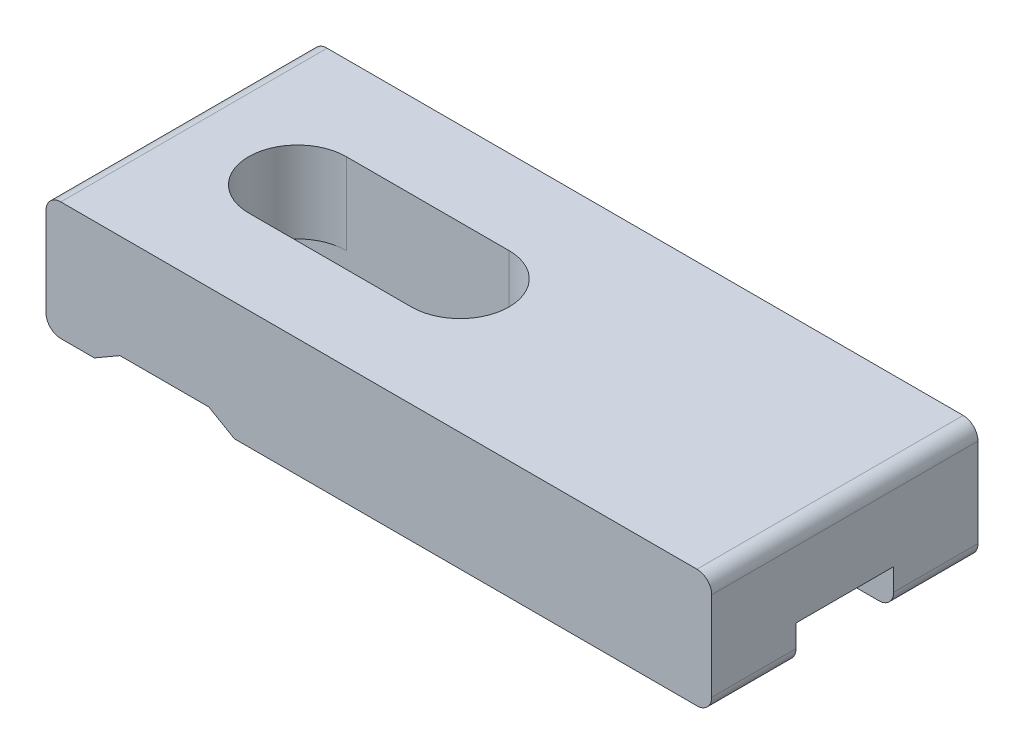
ISO-10303-21;
HEADER;
FILE_DESCRIPTION(('STEP AP214'),'2;1');
FILE_NAME('part.step','',(''),(''),'','','');
FILE_SCHEMA(('AUTOMOTIVE_DESIGN { 1 0 10303 214 1 1 1 1 }'));
ENDSEC;
DATA;
#1=APPLICATION_CONTEXT('core data for automotive mechanical design processes');
#2=APPLICATION_PROTOCOL_DEFINITION('international standard','automotive_design',2000,#1);
#3=PRODUCT_CONTEXT('',#1,'mechanical');
#4=PRODUCT('Part','Part','',(#3));
#5=PRODUCT_RELATED_PRODUCT_CATEGORY('part','',(#4));
#6=PRODUCT_DEFINITION_FORMATION('','',#4);
#7=PRODUCT_DEFINITION_CONTEXT('part definition',#1,'design');
#8=PRODUCT_DEFINITION('design','',#6,#7);
#9=PRODUCT_DEFINITION_SHAPE('','',#8);
#10=(LENGTH_UNIT() NAMED_UNIT(*) SI_UNIT(.MILLI.,.METRE.));
#11=(NAMED_UNIT(*) PLANE_ANGLE_UNIT() SI_UNIT($,.RADIAN.));
#12=(NAMED_UNIT(*) SI_UNIT($,.STERADIAN.) SOLID_ANGLE_UNIT());
#13=UNCERTAINTY_MEASURE_WITH_UNIT(LENGTH_MEASURE(1.E-05),#10,'distance_accuracy_value','');
#14=(GEOMETRIC_REPRESENTATION_CONTEXT(3) GLOBAL_UNCERTAINTY_ASSIGNED_CONTEXT((#13)) GLOBAL_UNIT_ASSIGNED_CONTEXT((#10,
#11,#12)) REPRESENTATION_CONTEXT('',''));
#15=CARTESIAN_POINT('',(0.,0.,0.));
#16=DIRECTION('',(0.,0.,1.));
#17=DIRECTION('',(1.,0.,0.));
#18=AXIS2_PLACEMENT_3D('',#15,#16,#17);
#19=CARTESIAN_POINT('',(-62.1670785358506,-7.19764912137909,24.));
#20=DIRECTION('',(0.,1.,0.));
#21=DIRECTION('',(0.,0.,1.));
#22=AXIS2_PLACEMENT_3D('',#19,#20,#21);
#23=PLANE('',#22);
#24=DIRECTION('',(-1.,0.,0.));
#25=VECTOR('',#24,1.);
#26=CARTESIAN_POINT('',(-40.8337452025173,-7.19764912137909,-8.8));
#27=LINE('',#26,#25);
#28=CARTESIAN_POINT('',(-53.4525473560343,-7.19764912137909,-8.8));
#29=VERTEX_POINT('',#28);
#30=CARTESIAN_POINT('',(-59.5004118691839,-7.19764912137909,-8.8));
#31=VERTEX_POINT('',#30);
#32=EDGE_CURVE('E299',#29,#31,#27,.T.);
#33=ORIENTED_EDGE('',*,*,#32,.T.);
#34=DIRECTION('',(0.,0.,-1.));
#35=VECTOR('',#34,1.);
#36=CARTESIAN_POINT('',(-59.5004118691839,-7.19764912137909,24.));
#37=LINE('',#36,#35);
#38=CARTESIAN_POINT('',(-59.5004118691839,-7.19764912137909,-24.));
#39=VERTEX_POINT('',#38);
#40=EDGE_CURVE('E42',#31,#39,#37,.T.);
#41=ORIENTED_EDGE('',*,*,#40,.T.);
#42=DIRECTION('',(1.,0.,0.));
#43=VECTOR('',#42,1.);
#44=CARTESIAN_POINT('',(-62.1670785358506,-7.19764912137909,-24.));
#45=LINE('',#44,#43);
#46=CARTESIAN_POINT('',(-53.4525473560343,-7.19764912137909,-24.));
#47=VERTEX_POINT('',#46);
#48=EDGE_CURVE('E210',#39,#47,#45,.T.);
#49=ORIENTED_EDGE('',*,*,#48,.T.);
#50=DIRECTION('',(0.,0.,1.));
#51=VECTOR('',#50,1.);
#52=CARTESIAN_POINT('',(-53.4525473560343,-7.19764912137909,-24.));
#53=LINE('',#52,#51);
#54=EDGE_CURVE('E213',#47,#29,#53,.T.);
#55=ORIENTED_EDGE('',*,*,#54,.T.);
#56=EDGE_LOOP('',(#33,#41,#49,#55));
#57=FACE_BOUND('',#56,.T.);
#58=ADVANCED_FACE('F34',(#57),#23,.F.);
#59=DIRECTION('',(1.,0.,0.));
#60=VECTOR('',#59,1.);
#61=CARTESIAN_POINT('',(-62.1670785358506,-7.19764912137909,24.));
#62=LINE('',#61,#60);
#63=CARTESIAN_POINT('',(-59.5004118691839,-7.19764912137909,24.));
#64=VERTEX_POINT('',#63);
#65=CARTESIAN_POINT('',(-53.4525473560343,-7.19764912137909,24.));
#66=VERTEX_POINT('',#65);
#67=EDGE_CURVE('E327',#64,#66,#62,.T.);
#68=ORIENTED_EDGE('',*,*,#67,.F.);
#69=DIRECTION('',(0.,0.,-1.));
#70=VECTOR('',#69,1.);
#71=CARTESIAN_POINT('',(-59.5004118691839,-7.19764912137909,24.));
#72=LINE('',#71,#70);
#73=CARTESIAN_POINT('',(-59.5004118691839,-7.19764912137909,8.80000000000001));
#74=VERTEX_POINT('',#73);
#75=EDGE_CURVE('E11',#64,#74,#72,.T.);
#76=ORIENTED_EDGE('',*,*,#75,.T.);
#77=DIRECTION('',(1.,0.,0.));
#78=VECTOR('',#77,1.);
#79=CARTESIAN_POINT('',(-11.5004118691839,-7.19764912137909,8.8));
#80=LINE('',#79,#78);
#81=CARTESIAN_POINT('',(-53.4525473560343,-7.19764912137909,8.80000000000001));
#82=VERTEX_POINT('',#81);
#83=EDGE_CURVE('E297',#74,#82,#80,.T.);
#84=ORIENTED_EDGE('',*,*,#83,.T.);
#85=EDGE_CURVE('E230',#82,#66,#53,.T.);
#86=ORIENTED_EDGE('',*,*,#85,.T.);
#87=EDGE_LOOP('',(#68,#76,#84,#86));
#88=FACE_BOUND('',#87,.T.);
#89=ADVANCED_FACE('F420',(#88),#23,.F.);
#90=CARTESIAN_POINT('',(-28.2149430490002,-7.19764912137909,-24.));
#91=VERTEX_POINT('',#90);
#92=CARTESIAN_POINT('',(55.1662547974827,-7.19764912137909,-24.));
#93=VERTEX_POINT('',#92);
#94=EDGE_CURVE('E219',#91,#93,#45,.T.);
#95=ORIENTED_EDGE('',*,*,#94,.T.);
#96=DIRECTION('',(0.,0.,-1.));
#97=VECTOR('',#96,1.);
#98=CARTESIAN_POINT('',(55.1662547974827,-7.19764912137909,24.));
#99=LINE('',#98,#97);
#100=CARTESIAN_POINT('',(55.1662547974827,-7.19764912137909,-8.8));
#101=VERTEX_POINT('',#100);
#102=EDGE_CURVE('E366',#93,#101,#99,.F.);
#103=ORIENTED_EDGE('',*,*,#102,.T.);
#104=CARTESIAN_POINT('',(-28.2149430490002,-7.19764912137909,-8.8));
#105=VERTEX_POINT('',#104);
#106=EDGE_CURVE('E301',#101,#105,#27,.T.);
#107=ORIENTED_EDGE('',*,*,#106,.T.);
#108=DIRECTION('',(0.,0.,1.));
#109=VECTOR('',#108,1.);
#110=CARTESIAN_POINT('',(-28.2149430490002,-7.19764912137909,-24.));
#111=LINE('',#110,#109);
#112=EDGE_CURVE('E259',#91,#105,#111,.T.);
#113=ORIENTED_EDGE('',*,*,#112,.F.);
#114=EDGE_LOOP('',(#95,#103,#107,#113));
#115=FACE_BOUND('',#114,.T.);
#116=ADVANCED_FACE('F456',(#115),#23,.F.);
#117=CARTESIAN_POINT('',(-62.1670785358506,14.1356842119542,24.));
#118=DIRECTION('',(1.,0.,0.));
#119=DIRECTION('',(0.,0.,-1.));
#120=AXIS2_PLACEMENT_3D('',#117,#118,#119);
#121=PLANE('',#120);
#122=DIRECTION('',(0.,-1.,0.));
#123=VECTOR('',#122,1.);
#124=CARTESIAN_POINT('',(-62.1670785358506,14.1356842119542,24.));
#125=LINE('',#124,#123);
#126=CARTESIAN_POINT('',(-62.1670785358506,11.4690175452876,24.));
#127=VERTEX_POINT('',#126);
#128=CARTESIAN_POINT('',(-62.1670785358506,-4.53098245471243,24.));
#129=VERTEX_POINT('',#128);
#130=EDGE_CURVE('E323',#127,#129,#125,.T.);
#131=ORIENTED_EDGE('',*,*,#130,.F.);
#132=DIRECTION('',(0.,0.,-1.));
#133=VECTOR('',#132,1.);
#134=CARTESIAN_POINT('',(-62.1670785358506,11.4690175452876,24.));
#135=LINE('',#134,#133);
#136=CARTESIAN_POINT('',(-62.1670785358506,11.4690175452876,-24.));
#137=VERTEX_POINT('',#136);
#138=EDGE_CURVE('E393',#127,#137,#135,.T.);
#139=ORIENTED_EDGE('',*,*,#138,.T.);
#140=DIRECTION('',(0.,-1.,0.));
#141=VECTOR('',#140,1.);
#142=CARTESIAN_POINT('',(-62.1670785358506,14.1356842119542,-24.));
#143=LINE('',#142,#141);
#144=CARTESIAN_POINT('',(-62.1670785358506,-4.53098245471243,-24.));
#145=VERTEX_POINT('',#144);
#146=EDGE_CURVE('E317',#137,#145,#143,.T.);
#147=ORIENTED_EDGE('',*,*,#146,.T.);
#148=DIRECTION('',(0.,0.,-1.));
#149=VECTOR('',#148,1.);
#150=CARTESIAN_POINT('',(-62.1670785358506,-4.53098245471243,24.));
#151=LINE('',#150,#149);
#152=CARTESIAN_POINT('',(-62.1670785358506,-4.53098245471243,-8.8));
#153=VERTEX_POINT('',#152);
#154=EDGE_CURVE('E391',#145,#153,#151,.F.);
#155=ORIENTED_EDGE('',*,*,#154,.T.);
#156=DIRECTION('',(0.,1.,0.));
#157=VECTOR('',#156,1.);
#158=CARTESIAN_POINT('',(-62.1670785358506,-7.19764912137909,-8.8));
#159=LINE('',#158,#157);
#160=CARTESIAN_POINT('',(-62.1670785358506,-0.530982454712426,-8.8));
#161=VERTEX_POINT('',#160);
#162=EDGE_CURVE('E269',#153,#161,#159,.T.);
#163=ORIENTED_EDGE('',*,*,#162,.T.);
#164=DIRECTION('',(0.,0.,1.));
#165=VECTOR('',#164,1.);
#166=CARTESIAN_POINT('',(-62.1670785358506,-0.530982454712426,-8.8));
#167=LINE('',#166,#165);
#168=CARTESIAN_POINT('',(-62.1670785358506,-0.530982454712428,8.8));
#169=VERTEX_POINT('',#168);
#170=EDGE_CURVE('E271',#161,#169,#167,.T.);
#171=ORIENTED_EDGE('',*,*,#170,.T.);
#172=DIRECTION('',(0.,-1.,0.));
#173=VECTOR('',#172,1.);
#174=CARTESIAN_POINT('',(-62.1670785358506,-7.1976491213791,8.8));
#175=LINE('',#174,#173);
#176=CARTESIAN_POINT('',(-62.1670785358506,-4.53098245471243,8.8));
#177=VERTEX_POINT('',#176);
#178=EDGE_CURVE('E275',#169,#177,#175,.T.);
#179=ORIENTED_EDGE('',*,*,#178,.T.);
#180=DIRECTION('',(0.,0.,-1.));
#181=VECTOR('',#180,1.);
#182=CARTESIAN_POINT('',(-62.1670785358506,-4.53098245471243,24.));
#183=LINE('',#182,#181);
#184=EDGE_CURVE('E57',#177,#129,#183,.F.);
#185=ORIENTED_EDGE('',*,*,#184,.T.);
#186=EDGE_LOOP('',(#131,#139,#147,#155,#163,#171,#179,#185));
#187=FACE_BOUND('',#186,.T.);
#188=ADVANCED_FACE('F397',(#187),#121,.F.);
#189=CARTESIAN_POINT('',(-28.2149430490002,-7.19764912137909,8.80000000000001));
#190=VERTEX_POINT('',#189);
#191=CARTESIAN_POINT('',(55.1662547974827,-7.19764912137909,8.79999999999999));
#192=VERTEX_POINT('',#191);
#193=EDGE_CURVE('E300',#190,#192,#80,.T.);
#194=ORIENTED_EDGE('',*,*,#193,.T.);
#195=DIRECTION('',(0.,0.,-1.));
#196=VECTOR('',#195,1.);
#197=CARTESIAN_POINT('',(55.1662547974827,-7.19764912137909,24.));
#198=LINE('',#197,#196);
#199=CARTESIAN_POINT('',(55.1662547974827,-7.19764912137909,24.));
#200=VERTEX_POINT('',#199);
#201=EDGE_CURVE('E376',#192,#200,#198,.F.);
#202=ORIENTED_EDGE('',*,*,#201,.T.);
#203=CARTESIAN_POINT('',(-28.2149430490002,-7.19764912137909,24.));
#204=VERTEX_POINT('',#203);
#205=EDGE_CURVE('E325',#204,#200,#62,.T.);
#206=ORIENTED_EDGE('',*,*,#205,.F.);
#207=EDGE_CURVE('E229',#190,#204,#111,.T.);
#208=ORIENTED_EDGE('',*,*,#207,.F.);
#209=EDGE_LOOP('',(#194,#202,#206,#208));
#210=FACE_BOUND('',#209,.T.);
#211=ADVANCED_FACE('F452',(#210),#23,.F.);
#212=CARTESIAN_POINT('',(57.8329214641494,-7.19764912137909,24.));
#213=DIRECTION('',(-1.,0.,0.));
#214=DIRECTION('',(0.,0.,1.));
#215=AXIS2_PLACEMENT_3D('',#212,#213,#214);
#216=PLANE('',#215);
#217=DIRECTION('',(0.,1.,0.));
#218=VECTOR('',#217,1.);
#219=CARTESIAN_POINT('',(57.8329214641494,-7.19764912137909,-8.8));
#220=LINE('',#219,#218);
#221=CARTESIAN_POINT('',(57.8329214641494,-4.53098245471243,-8.8));
#222=VERTEX_POINT('',#221);
#223=CARTESIAN_POINT('',(57.8329214641494,-0.530982454712426,-8.8));
#224=VERTEX_POINT('',#223);
#225=EDGE_CURVE('E268',#222,#224,#220,.T.);
#226=ORIENTED_EDGE('',*,*,#225,.F.);
#227=DIRECTION('',(0.,0.,-1.));
#228=VECTOR('',#227,1.);
#229=CARTESIAN_POINT('',(57.8329214641494,-4.53098245471243,24.));
#230=LINE('',#229,#228);
#231=CARTESIAN_POINT('',(57.8329214641494,-4.53098245471243,-24.));
#232=VERTEX_POINT('',#231);
#233=EDGE_CURVE('E355',#222,#232,#230,.T.);
#234=ORIENTED_EDGE('',*,*,#233,.T.);
#235=DIRECTION('',(0.,1.,0.));
#236=VECTOR('',#235,1.);
#237=CARTESIAN_POINT('',(57.8329214641494,-7.19764912137909,-24.));
#238=LINE('',#237,#236);
#239=CARTESIAN_POINT('',(57.8329214641494,11.4690175452876,-24.));
#240=VERTEX_POINT('',#239);
#241=EDGE_CURVE('E218',#232,#240,#238,.T.);
#242=ORIENTED_EDGE('',*,*,#241,.T.);
#243=DIRECTION('',(0.,0.,-1.));
#244=VECTOR('',#243,1.);
#245=CARTESIAN_POINT('',(57.8329214641494,11.4690175452876,24.));
#246=LINE('',#245,#244);
#247=CARTESIAN_POINT('',(57.8329214641494,11.4690175452876,24.));
#248=VERTEX_POINT('',#247);
#249=EDGE_CURVE('E350',#240,#248,#246,.F.);
#250=ORIENTED_EDGE('',*,*,#249,.T.);
#251=DIRECTION('',(0.,1.,0.));
#252=VECTOR('',#251,1.);
#253=CARTESIAN_POINT('',(57.8329214641494,-7.19764912137909,24.));
#254=LINE('',#253,#252);
#255=CARTESIAN_POINT('',(57.8329214641494,-4.53098245471243,24.));
#256=VERTEX_POINT('',#255);
#257=EDGE_CURVE('E329',#256,#248,#254,.T.);
#258=ORIENTED_EDGE('',*,*,#257,.F.);
#259=DIRECTION('',(0.,0.,-1.));
#260=VECTOR('',#259,1.);
#261=CARTESIAN_POINT('',(57.8329214641494,-4.53098245471243,24.));
#262=LINE('',#261,#260);
#263=CARTESIAN_POINT('',(57.8329214641494,-4.53098245471243,8.8));
#264=VERTEX_POINT('',#263);
#265=EDGE_CURVE('E352',#256,#264,#262,.T.);
#266=ORIENTED_EDGE('',*,*,#265,.T.);
#267=DIRECTION('',(0.,-1.,0.));
#268=VECTOR('',#267,1.);
#269=CARTESIAN_POINT('',(57.8329214641494,-7.1976491213791,8.8));
#270=LINE('',#269,#268);
#271=CARTESIAN_POINT('',(57.8329214641494,-0.530982454712428,8.8));
#272=VERTEX_POINT('',#271);
#273=EDGE_CURVE('E272',#272,#264,#270,.T.);
#274=ORIENTED_EDGE('',*,*,#273,.F.);
#275=DIRECTION('',(0.,0.,1.));
#276=VECTOR('',#275,1.);
#277=CARTESIAN_POINT('',(57.8329214641494,-0.530982454712426,-8.8));
#278=LINE('',#277,#276);
#279=EDGE_CURVE('E279',#224,#272,#278,.T.);
#280=ORIENTED_EDGE('',*,*,#279,.F.);
#281=EDGE_LOOP('',(#226,#234,#242,#250,#258,#266,#274,#280));
#282=FACE_BOUND('',#281,.T.);
#283=ADVANCED_FACE('F446',(#282),#216,.F.);
#284=CARTESIAN_POINT('',(57.8329214641494,14.1356842119542,24.));
#285=DIRECTION('',(0.,-1.,0.));
#286=DIRECTION('',(0.,0.,-1.));
#287=AXIS2_PLACEMENT_3D('',#284,#285,#286);
#288=PLANE('',#287);
#289=DIRECTION('',(1.,0.,0.));
#290=VECTOR('',#289,1.);
#291=CARTESIAN_POINT('',(-11.5004118691839,14.1356842119542,8.8));
#292=LINE('',#291,#290);
#293=CARTESIAN_POINT('',(-40.8337452025173,14.1356842119542,8.8));
#294=VERTEX_POINT('',#293);
#295=CARTESIAN_POINT('',(-11.5004118691839,14.1356842119542,8.8));
#296=VERTEX_POINT('',#295);
#297=EDGE_CURVE('E306',#294,#296,#292,.T.);
#298=ORIENTED_EDGE('',*,*,#297,.F.);
#299=CARTESIAN_POINT('',(-40.8337452025173,14.1356842119542,0.));
#300=DIRECTION('',(0.,1.,0.));
#301=DIRECTION('',(0.,0.,-1.));
#302=AXIS2_PLACEMENT_3D('',#299,#300,#301);
#303=CIRCLE('',#302,8.8);
#304=CARTESIAN_POINT('',(-40.8337452025173,14.1356842119542,-8.8));
#305=VERTEX_POINT('',#304);
#306=EDGE_CURVE('E296',#305,#294,#303,.T.);
#307=ORIENTED_EDGE('',*,*,#306,.F.);
#308=DIRECTION('',(-1.,0.,0.));
#309=VECTOR('',#308,1.);
#310=CARTESIAN_POINT('',(-40.8337452025173,14.1356842119542,-8.8));
#311=LINE('',#310,#309);
#312=CARTESIAN_POINT('',(-11.5004118691839,14.1356842119542,-8.8));
#313=VERTEX_POINT('',#312);
#314=EDGE_CURVE('E312',#313,#305,#311,.T.);
#315=ORIENTED_EDGE('',*,*,#314,.F.);
#316=CARTESIAN_POINT('',(-11.5004118691839,14.1356842119542,0.));
#317=DIRECTION('',(0.,1.,0.));
#318=DIRECTION('',(0.,0.,-1.));
#319=AXIS2_PLACEMENT_3D('',#316,#317,#318);
#320=CIRCLE('',#319,8.8);
#321=EDGE_CURVE('E309',#296,#313,#320,.T.);
#322=ORIENTED_EDGE('',*,*,#321,.F.);
#323=EDGE_LOOP('',(#298,#307,#315,#322));
#324=FACE_BOUND('',#323,.T.);
#325=DIRECTION('',(-1.,0.,0.));
#326=VECTOR('',#325,1.);
#327=CARTESIAN_POINT('',(57.8329214641494,14.1356842119542,24.));
#328=LINE('',#327,#326);
#329=CARTESIAN_POINT('',(55.1662547974827,14.1356842119542,24.));
#330=VERTEX_POINT('',#329);
#331=CARTESIAN_POINT('',(-59.5004118691839,14.1356842119542,24.));
#332=VERTEX_POINT('',#331);
#333=EDGE_CURVE('E332',#330,#332,#328,.T.);
#334=ORIENTED_EDGE('',*,*,#333,.F.);
#335=DIRECTION('',(0.,0.,-1.));
#336=VECTOR('',#335,1.);
#337=CARTESIAN_POINT('',(55.1662547974827,14.1356842119542,24.));
#338=LINE('',#337,#336);
#339=CARTESIAN_POINT('',(55.1662547974827,14.1356842119542,-24.));
#340=VERTEX_POINT('',#339);
#341=EDGE_CURVE('E387',#330,#340,#338,.T.);
#342=ORIENTED_EDGE('',*,*,#341,.T.);
#343=DIRECTION('',(-1.,0.,0.));
#344=VECTOR('',#343,1.);
#345=CARTESIAN_POINT('',(57.8329214641494,14.1356842119542,-24.));
#346=LINE('',#345,#344);
#347=CARTESIAN_POINT('',(-59.5004118691839,14.1356842119542,-24.));
#348=VERTEX_POINT('',#347);
#349=EDGE_CURVE('E326',#340,#348,#346,.T.);
#350=ORIENTED_EDGE('',*,*,#349,.T.);
#351=DIRECTION('',(0.,0.,-1.));
#352=VECTOR('',#351,1.);
#353=CARTESIAN_POINT('',(-59.5004118691839,14.1356842119542,24.));
#354=LINE('',#353,#352);
#355=EDGE_CURVE('E385',#348,#332,#354,.F.);
#356=ORIENTED_EDGE('',*,*,#355,.T.);
#357=EDGE_LOOP('',(#334,#342,#350,#356));
#358=FACE_BOUND('',#357,.T.);
#359=ADVANCED_FACE('F438',(#324,#358),#288,.F.);
#360=CARTESIAN_POINT('',(-62.1670785358506,-7.19764912137909,24.));
#361=DIRECTION('',(0.,0.,1.));
#362=DIRECTION('',(1.,0.,0.));
#363=AXIS2_PLACEMENT_3D('',#360,#361,#362);
#364=PLANE('',#363);
#365=ORIENTED_EDGE('',*,*,#205,.T.);
#366=CARTESIAN_POINT('',(55.1662547974827,-4.53098245471243,24.));
#367=DIRECTION('',(0.,0.,1.));
#368=DIRECTION('',(1.,0.,0.));
#369=AXIS2_PLACEMENT_3D('',#366,#367,#368);
#370=CIRCLE('',#369,2.66666666666667);
#371=EDGE_CURVE('E383',#200,#256,#370,.T.);
#372=ORIENTED_EDGE('',*,*,#371,.T.);
#373=ORIENTED_EDGE('',*,*,#257,.T.);
#374=CARTESIAN_POINT('',(55.1662547974827,11.4690175452876,24.));
#375=DIRECTION('',(0.,0.,1.));
#376=DIRECTION('',(1.,0.,0.));
#377=AXIS2_PLACEMENT_3D('',#374,#375,#376);
#378=CIRCLE('',#377,2.66666666666667);
#379=EDGE_CURVE('E381',#248,#330,#378,.T.);
#380=ORIENTED_EDGE('',*,*,#379,.T.);
#381=ORIENTED_EDGE('',*,*,#333,.T.);
#382=CARTESIAN_POINT('',(-59.5004118691839,11.4690175452876,24.));
#383=DIRECTION('',(0.,0.,1.));
#384=DIRECTION('',(1.,0.,0.));
#385=AXIS2_PLACEMENT_3D('',#382,#383,#384);
#386=CIRCLE('',#385,2.66666666666667);
#387=EDGE_CURVE('E379',#332,#127,#386,.T.);
#388=ORIENTED_EDGE('',*,*,#387,.T.);
#389=ORIENTED_EDGE('',*,*,#130,.T.);
#390=CARTESIAN_POINT('',(-59.5004118691839,-4.53098245471243,24.));
#391=DIRECTION('',(0.,0.,1.));
#392=DIRECTION('',(1.,0.,0.));
#393=AXIS2_PLACEMENT_3D('',#390,#391,#392);
#394=CIRCLE('',#393,2.66666666666667);
#395=EDGE_CURVE('E49',#129,#64,#394,.T.);
#396=ORIENTED_EDGE('',*,*,#395,.T.);
#397=ORIENTED_EDGE('',*,*,#67,.T.);
#398=DIRECTION('',(-0.866025403784442,-0.499999999999995,0.));
#399=VECTOR('',#398,1.);
#400=CARTESIAN_POINT('',(-53.4525473560343,-7.19764912137909,24.));
#401=LINE('',#400,#399);
#402=CARTESIAN_POINT('',(-48.8337452025173,-4.53098245471243,24.));
#403=VERTEX_POINT('',#402);
#404=EDGE_CURVE('E246',#403,#66,#401,.T.);
#405=ORIENTED_EDGE('',*,*,#404,.F.);
#406=DIRECTION('',(-1.,0.,0.));
#407=VECTOR('',#406,1.);
#408=CARTESIAN_POINT('',(-48.8337452025173,-4.53098245471243,24.));
#409=LINE('',#408,#407);
#410=CARTESIAN_POINT('',(-32.8337452025173,-4.53098245471243,24.));
#411=VERTEX_POINT('',#410);
#412=EDGE_CURVE('E238',#411,#403,#409,.T.);
#413=ORIENTED_EDGE('',*,*,#412,.F.);
#414=DIRECTION('',(-0.866025403784442,0.499999999999994,0.));
#415=VECTOR('',#414,1.);
#416=CARTESIAN_POINT('',(-32.8337452025173,-4.53098245471243,24.));
#417=LINE('',#416,#415);
#418=EDGE_CURVE('E242',#204,#411,#417,.T.);
#419=ORIENTED_EDGE('',*,*,#418,.F.);
#420=EDGE_LOOP('',(#365,#372,#373,#380,#381,#388,#389,#396,#397,#405,#413,#419));
#421=FACE_BOUND('',#420,.T.);
#422=ADVANCED_FACE('F434',(#421),#364,.T.);
#423=CARTESIAN_POINT('',(-62.1670785358506,-7.19764912137909,-24.));
#424=DIRECTION('',(0.,0.,1.));
#425=DIRECTION('',(1.,0.,0.));
#426=AXIS2_PLACEMENT_3D('',#423,#424,#425);
#427=PLANE('',#426);
#428=ORIENTED_EDGE('',*,*,#241,.F.);
#429=CARTESIAN_POINT('',(55.1662547974827,-4.53098245471243,-24.));
#430=DIRECTION('',(0.,0.,1.));
#431=DIRECTION('',(1.,0.,0.));
#432=AXIS2_PLACEMENT_3D('',#429,#430,#431);
#433=CIRCLE('',#432,2.66666666666667);
#434=EDGE_CURVE('E364',#232,#93,#433,.F.);
#435=ORIENTED_EDGE('',*,*,#434,.T.);
#436=ORIENTED_EDGE('',*,*,#94,.F.);
#437=DIRECTION('',(-0.866025403784442,0.499999999999994,0.));
#438=VECTOR('',#437,1.);
#439=CARTESIAN_POINT('',(-32.8337452025173,-4.53098245471243,-24.));
#440=LINE('',#439,#438);
#441=CARTESIAN_POINT('',(-32.8337452025173,-4.53098245471243,-24.));
#442=VERTEX_POINT('',#441);
#443=EDGE_CURVE('E237',#91,#442,#440,.T.);
#444=ORIENTED_EDGE('',*,*,#443,.T.);
#445=DIRECTION('',(-1.,0.,0.));
#446=VECTOR('',#445,1.);
#447=CARTESIAN_POINT('',(-48.8337452025173,-4.53098245471243,-24.));
#448=LINE('',#447,#446);
#449=CARTESIAN_POINT('',(-48.8337452025173,-4.53098245471243,-24.));
#450=VERTEX_POINT('',#449);
#451=EDGE_CURVE('E236',#442,#450,#448,.T.);
#452=ORIENTED_EDGE('',*,*,#451,.T.);
#453=DIRECTION('',(-0.866025403784442,-0.499999999999995,0.));
#454=VECTOR('',#453,1.);
#455=CARTESIAN_POINT('',(-53.4525473560343,-7.19764912137909,-24.));
#456=LINE('',#455,#454);
#457=EDGE_CURVE('E225',#450,#47,#456,.T.);
#458=ORIENTED_EDGE('',*,*,#457,.T.);
#459=ORIENTED_EDGE('',*,*,#48,.F.);
#460=CARTESIAN_POINT('',(-59.5004118691839,-4.53098245471243,-24.));
#461=DIRECTION('',(0.,0.,1.));
#462=DIRECTION('',(1.,0.,0.));
#463=AXIS2_PLACEMENT_3D('',#460,#461,#462);
#464=CIRCLE('',#463,2.66666666666667);
#465=EDGE_CURVE('E358',#39,#145,#464,.F.);
#466=ORIENTED_EDGE('',*,*,#465,.T.);
#467=ORIENTED_EDGE('',*,*,#146,.F.);
#468=CARTESIAN_POINT('',(-59.5004118691839,11.4690175452876,-24.));
#469=DIRECTION('',(0.,0.,1.));
#470=DIRECTION('',(1.,0.,0.));
#471=AXIS2_PLACEMENT_3D('',#468,#469,#470);
#472=CIRCLE('',#471,2.66666666666667);
#473=EDGE_CURVE('E360',#137,#348,#472,.F.);
#474=ORIENTED_EDGE('',*,*,#473,.T.);
#475=ORIENTED_EDGE('',*,*,#349,.F.);
#476=CARTESIAN_POINT('',(55.1662547974827,11.4690175452876,-24.));
#477=DIRECTION('',(0.,0.,1.));
#478=DIRECTION('',(1.,0.,0.));
#479=AXIS2_PLACEMENT_3D('',#476,#477,#478);
#480=CIRCLE('',#479,2.66666666666667);
#481=EDGE_CURVE('E362',#340,#240,#480,.F.);
#482=ORIENTED_EDGE('',*,*,#481,.T.);
#483=EDGE_LOOP('',(#428,#435,#436,#444,#452,#458,#459,#466,#467,#474,#475,#482));
#484=FACE_BOUND('',#483,.T.);
#485=ADVANCED_FACE('F233',(#484),#427,.F.);
#486=CARTESIAN_POINT('',(-40.8337452025173,-7.19764912137909,0.));
#487=DIRECTION('',(0.,1.,0.));
#488=DIRECTION('',(0.,0.,1.));
#489=AXIS2_PLACEMENT_3D('',#486,#487,#488);
#490=CYLINDRICAL_SURFACE('',#489,8.8);
#491=DIRECTION('',(0.,1.,0.));
#492=VECTOR('',#491,1.);
#493=CARTESIAN_POINT('',(-40.8337452025173,-7.19764912137909,8.80000000000001));
#494=LINE('',#493,#492);
#495=CARTESIAN_POINT('',(-40.8337452025173,-0.530982454712428,8.8));
#496=VERTEX_POINT('',#495);
#497=EDGE_CURVE('E303',#496,#294,#494,.T.);
#498=ORIENTED_EDGE('',*,*,#497,.F.);
#499=CARTESIAN_POINT('',(-40.8337452025173,-0.530982454712427,0.));
#500=DIRECTION('',(0.,1.,0.));
#501=DIRECTION('',(0.,0.,1.));
#502=AXIS2_PLACEMENT_3D('',#499,#500,#501);
#503=CIRCLE('',#502,8.8);
#504=CARTESIAN_POINT('',(-40.8337452025173,-0.530982454712426,-8.8));
#505=VERTEX_POINT('',#504);
#506=EDGE_CURVE('E293',#496,#505,#503,.F.);
#507=ORIENTED_EDGE('',*,*,#506,.T.);
#508=DIRECTION('',(0.,1.,0.));
#509=VECTOR('',#508,1.);
#510=CARTESIAN_POINT('',(-40.8337452025173,-7.19764912137909,-8.8));
#511=LINE('',#510,#509);
#512=EDGE_CURVE('E315',#505,#305,#511,.T.);
#513=ORIENTED_EDGE('',*,*,#512,.T.);
#514=ORIENTED_EDGE('',*,*,#306,.T.);
#515=EDGE_LOOP('',(#498,#507,#513,#514));
#516=FACE_BOUND('',#515,.T.);
#517=ADVANCED_FACE('F444',(#516),#490,.F.);
#518=CARTESIAN_POINT('',(-40.8337452025173,-7.19764912137909,-8.8));
#519=DIRECTION('',(0.,0.,-1.));
#520=DIRECTION('',(-1.,0.,0.));
#521=AXIS2_PLACEMENT_3D('',#518,#519,#520);
#522=PLANE('',#521);
#523=ORIENTED_EDGE('',*,*,#106,.F.);
#524=CARTESIAN_POINT('',(55.1662547974827,-4.53098245471243,-8.8));
#525=DIRECTION('',(0.,0.,-1.));
#526=DIRECTION('',(-1.,0.,0.));
#527=AXIS2_PLACEMENT_3D('',#524,#525,#526);
#528=CIRCLE('',#527,2.66666666666667);
#529=EDGE_CURVE('E370',#101,#222,#528,.F.);
#530=ORIENTED_EDGE('',*,*,#529,.T.);
#531=ORIENTED_EDGE('',*,*,#225,.T.);
#532=DIRECTION('',(1.,0.,0.));
#533=VECTOR('',#532,1.);
#534=CARTESIAN_POINT('',(-62.1670785358506,-0.530982454712426,-8.8));
#535=LINE('',#534,#533);
#536=CARTESIAN_POINT('',(-11.5004118691839,-0.530982454712426,-8.8));
#537=VERTEX_POINT('',#536);
#538=EDGE_CURVE('E277',#537,#224,#535,.T.);
#539=ORIENTED_EDGE('',*,*,#538,.F.);
#540=DIRECTION('',(0.,1.,0.));
#541=VECTOR('',#540,1.);
#542=CARTESIAN_POINT('',(-11.5004118691839,-7.19764912137909,-8.8));
#543=LINE('',#542,#541);
#544=EDGE_CURVE('E318',#537,#313,#543,.T.);
#545=ORIENTED_EDGE('',*,*,#544,.T.);
#546=ORIENTED_EDGE('',*,*,#314,.T.);
#547=ORIENTED_EDGE('',*,*,#512,.F.);
#548=EDGE_CURVE('E289',#161,#505,#535,.T.);
#549=ORIENTED_EDGE('',*,*,#548,.F.);
#550=ORIENTED_EDGE('',*,*,#162,.F.);
#551=CARTESIAN_POINT('',(-59.5004118691839,-4.53098245471243,-8.8));
#552=DIRECTION('',(0.,0.,-1.));
#553=DIRECTION('',(-1.,0.,0.));
#554=AXIS2_PLACEMENT_3D('',#551,#552,#553);
#555=CIRCLE('',#554,2.66666666666667);
#556=EDGE_CURVE('E368',#153,#31,#555,.F.);
#557=ORIENTED_EDGE('',*,*,#556,.T.);
#558=ORIENTED_EDGE('',*,*,#32,.F.);
#559=DIRECTION('',(0.866025403784442,0.499999999999995,0.));
#560=VECTOR('',#559,1.);
#561=CARTESIAN_POINT('',(-43.9884457408965,-1.73354750624135,-8.8));
#562=LINE('',#561,#560);
#563=CARTESIAN_POINT('',(-48.8337452025173,-4.53098245471243,-8.8));
#564=VERTEX_POINT('',#563);
#565=EDGE_CURVE('E228',#29,#564,#562,.T.);
#566=ORIENTED_EDGE('',*,*,#565,.T.);
#567=DIRECTION('',(1.,0.,0.));
#568=VECTOR('',#567,1.);
#569=CARTESIAN_POINT('',(-40.8337452025173,-4.53098245471243,-8.8));
#570=LINE('',#569,#568);
#571=CARTESIAN_POINT('',(-32.8337452025173,-4.53098245471243,-8.8));
#572=VERTEX_POINT('',#571);
#573=EDGE_CURVE('E264',#564,#572,#570,.T.);
#574=ORIENTED_EDGE('',*,*,#573,.T.);
#575=DIRECTION('',(0.866025403784442,-0.499999999999995,0.));
#576=VECTOR('',#575,1.);
#577=CARTESIAN_POINT('',(-37.6790446641381,-1.73354750624135,-8.8));
#578=LINE('',#577,#576);
#579=EDGE_CURVE('E253',#572,#105,#578,.T.);
#580=ORIENTED_EDGE('',*,*,#579,.T.);
#581=EDGE_LOOP('',(#523,#530,#531,#539,#545,#546,#547,#549,#550,#557,#558,#566,#574,#580));
#582=FACE_BOUND('',#581,.T.);
#583=ADVANCED_FACE('F409',(#582),#522,.F.);
#584=CARTESIAN_POINT('',(-11.5004118691839,-7.19764912137909,0.));
#585=DIRECTION('',(0.,1.,0.));
#586=DIRECTION('',(0.,0.,1.));
#587=AXIS2_PLACEMENT_3D('',#584,#585,#586);
#588=CYLINDRICAL_SURFACE('',#587,8.8);
#589=ORIENTED_EDGE('',*,*,#544,.F.);
#590=CARTESIAN_POINT('',(-11.5004118691839,-0.530982454712427,0.));
#591=DIRECTION('',(0.,1.,0.));
#592=DIRECTION('',(0.,0.,1.));
#593=AXIS2_PLACEMENT_3D('',#590,#591,#592);
#594=CIRCLE('',#593,8.8);
#595=CARTESIAN_POINT('',(-11.5004118691839,-0.530982454712428,8.8));
#596=VERTEX_POINT('',#595);
#597=EDGE_CURVE('E287',#537,#596,#594,.F.);
#598=ORIENTED_EDGE('',*,*,#597,.T.);
#599=DIRECTION('',(0.,1.,0.));
#600=VECTOR('',#599,1.);
#601=CARTESIAN_POINT('',(-11.5004118691839,-7.19764912137909,8.8));
#602=LINE('',#601,#600);
#603=EDGE_CURVE('E320',#596,#296,#602,.T.);
#604=ORIENTED_EDGE('',*,*,#603,.T.);
#605=ORIENTED_EDGE('',*,*,#321,.T.);
#606=EDGE_LOOP('',(#589,#598,#604,#605));
#607=FACE_BOUND('',#606,.T.);
#608=ADVANCED_FACE('F488',(#607),#588,.F.);
#609=CARTESIAN_POINT('',(-11.5004118691839,-7.19764912137909,8.8));
#610=DIRECTION('',(0.,0.,1.));
#611=DIRECTION('',(1.,0.,0.));
#612=AXIS2_PLACEMENT_3D('',#609,#610,#611);
#613=PLANE('',#612);
#614=ORIENTED_EDGE('',*,*,#273,.T.);
#615=CARTESIAN_POINT('',(55.1662547974827,-4.53098245471243,8.79999999999998));
#616=DIRECTION('',(0.,0.,1.));
#617=DIRECTION('',(1.,0.,0.));
#618=AXIS2_PLACEMENT_3D('',#615,#616,#617);
#619=CIRCLE('',#618,2.66666666666667);
#620=EDGE_CURVE('E374',#264,#192,#619,.F.);
#621=ORIENTED_EDGE('',*,*,#620,.T.);
#622=ORIENTED_EDGE('',*,*,#193,.F.);
#623=DIRECTION('',(-0.866025403784442,0.499999999999995,0.));
#624=VECTOR('',#623,1.);
#625=CARTESIAN_POINT('',(-15.6790446641379,-14.435253428413,8.8));
#626=LINE('',#625,#624);
#627=CARTESIAN_POINT('',(-32.8337452025173,-4.53098245471242,8.8));
#628=VERTEX_POINT('',#627);
#629=EDGE_CURVE('E335',#190,#628,#626,.T.);
#630=ORIENTED_EDGE('',*,*,#629,.T.);
#631=DIRECTION('',(-1.,0.,0.));
#632=VECTOR('',#631,1.);
#633=CARTESIAN_POINT('',(-11.5004118691839,-4.53098245471243,8.8));
#634=LINE('',#633,#632);
#635=CARTESIAN_POINT('',(-48.8337452025173,-4.53098245471243,8.80000000000001));
#636=VERTEX_POINT('',#635);
#637=EDGE_CURVE('E344',#628,#636,#634,.T.);
#638=ORIENTED_EDGE('',*,*,#637,.T.);
#639=DIRECTION('',(-0.866025403784442,-0.499999999999995,0.));
#640=VECTOR('',#639,1.);
#641=CARTESIAN_POINT('',(-21.9884457408963,10.9681584159303,8.8));
#642=LINE('',#641,#640);
#643=EDGE_CURVE('E347',#636,#82,#642,.T.);
#644=ORIENTED_EDGE('',*,*,#643,.T.);
#645=ORIENTED_EDGE('',*,*,#83,.F.);
#646=CARTESIAN_POINT('',(-59.5004118691839,-4.53098245471243,8.80000000000001));
#647=DIRECTION('',(0.,0.,1.));
#648=DIRECTION('',(1.,0.,0.));
#649=AXIS2_PLACEMENT_3D('',#646,#647,#648);
#650=CIRCLE('',#649,2.66666666666667);
#651=EDGE_CURVE('E372',#74,#177,#650,.F.);
#652=ORIENTED_EDGE('',*,*,#651,.T.);
#653=ORIENTED_EDGE('',*,*,#178,.F.);
#654=DIRECTION('',(1.,0.,0.));
#655=VECTOR('',#654,1.);
#656=CARTESIAN_POINT('',(-62.1670785358506,-0.530982454712428,8.8));
#657=LINE('',#656,#655);
#658=EDGE_CURVE('E284',#169,#496,#657,.T.);
#659=ORIENTED_EDGE('',*,*,#658,.T.);
#660=ORIENTED_EDGE('',*,*,#497,.T.);
#661=ORIENTED_EDGE('',*,*,#297,.T.);
#662=ORIENTED_EDGE('',*,*,#603,.F.);
#663=EDGE_CURVE('E288',#596,#272,#657,.T.);
#664=ORIENTED_EDGE('',*,*,#663,.T.);
#665=EDGE_LOOP('',(#614,#621,#622,#630,#638,#644,#645,#652,#653,#659,#660,#661,#662,#664));
#666=FACE_BOUND('',#665,.T.);
#667=ADVANCED_FACE('F423',(#666),#613,.F.);
#668=CARTESIAN_POINT('',(-62.1670785358506,-0.530982454712426,-8.8));
#669=DIRECTION('',(0.,1.,0.));
#670=DIRECTION('',(0.,0.,1.));
#671=AXIS2_PLACEMENT_3D('',#668,#669,#670);
#672=PLANE('',#671);
#673=ORIENTED_EDGE('',*,*,#538,.T.);
#674=ORIENTED_EDGE('',*,*,#279,.T.);
#675=ORIENTED_EDGE('',*,*,#663,.F.);
#676=ORIENTED_EDGE('',*,*,#597,.F.);
#677=EDGE_LOOP('',(#673,#674,#675,#676));
#678=FACE_BOUND('',#677,.T.);
#679=ADVANCED_FACE('F485',(#678),#672,.F.);
#680=ORIENTED_EDGE('',*,*,#658,.F.);
#681=ORIENTED_EDGE('',*,*,#170,.F.);
#682=ORIENTED_EDGE('',*,*,#548,.T.);
#683=ORIENTED_EDGE('',*,*,#506,.F.);
#684=EDGE_LOOP('',(#680,#681,#682,#683));
#685=FACE_BOUND('',#684,.T.);
#686=ADVANCED_FACE('F413',(#685),#672,.F.);
#687=CARTESIAN_POINT('',(-32.8337452025173,-4.53098245471243,-24.));
#688=DIRECTION('',(0.499999999999995,0.866025403784442,0.));
#689=DIRECTION('',(-0.866025403784442,0.499999999999995,0.));
#690=AXIS2_PLACEMENT_3D('',#687,#688,#689);
#691=PLANE('',#690);
#692=ORIENTED_EDGE('',*,*,#207,.T.);
#693=ORIENTED_EDGE('',*,*,#418,.T.);
#694=DIRECTION('',(0.,0.,1.));
#695=VECTOR('',#694,1.);
#696=CARTESIAN_POINT('',(-32.8337452025173,-4.53098245471243,-24.));
#697=LINE('',#696,#695);
#698=EDGE_CURVE('E258',#628,#411,#697,.T.);
#699=ORIENTED_EDGE('',*,*,#698,.F.);
#700=ORIENTED_EDGE('',*,*,#629,.F.);
#701=EDGE_LOOP('',(#692,#693,#699,#700));
#702=FACE_BOUND('',#701,.T.);
#703=ADVANCED_FACE('F530',(#702),#691,.F.);
#704=CARTESIAN_POINT('',(-48.8337452025173,-4.53098245471243,-24.));
#705=DIRECTION('',(0.,1.,0.));
#706=DIRECTION('',(0.,0.,1.));
#707=AXIS2_PLACEMENT_3D('',#704,#705,#706);
#708=PLANE('',#707);
#709=ORIENTED_EDGE('',*,*,#698,.T.);
#710=ORIENTED_EDGE('',*,*,#412,.T.);
#711=DIRECTION('',(0.,0.,1.));
#712=VECTOR('',#711,1.);
#713=CARTESIAN_POINT('',(-48.8337452025173,-4.53098245471243,-24.));
#714=LINE('',#713,#712);
#715=EDGE_CURVE('E254',#636,#403,#714,.T.);
#716=ORIENTED_EDGE('',*,*,#715,.F.);
#717=ORIENTED_EDGE('',*,*,#637,.F.);
#718=EDGE_LOOP('',(#709,#710,#716,#717));
#719=FACE_BOUND('',#718,.T.);
#720=ADVANCED_FACE('F429',(#719),#708,.F.);
#721=CARTESIAN_POINT('',(-53.4525473560343,-7.19764912137909,-24.));
#722=DIRECTION('',(-0.499999999999995,0.866025403784442,0.));
#723=DIRECTION('',(-0.866025403784442,-0.499999999999995,0.));
#724=AXIS2_PLACEMENT_3D('',#721,#722,#723);
#725=PLANE('',#724);
#726=ORIENTED_EDGE('',*,*,#715,.T.);
#727=ORIENTED_EDGE('',*,*,#404,.T.);
#728=ORIENTED_EDGE('',*,*,#85,.F.);
#729=ORIENTED_EDGE('',*,*,#643,.F.);
#730=EDGE_LOOP('',(#726,#727,#728,#729));
#731=FACE_BOUND('',#730,.T.);
#732=ADVANCED_FACE('F427',(#731),#725,.F.);
#733=ORIENTED_EDGE('',*,*,#54,.F.);
#734=ORIENTED_EDGE('',*,*,#457,.F.);
#735=EDGE_CURVE('E251',#450,#564,#714,.T.);
#736=ORIENTED_EDGE('',*,*,#735,.T.);
#737=ORIENTED_EDGE('',*,*,#565,.F.);
#738=EDGE_LOOP('',(#733,#734,#736,#737));
#739=FACE_BOUND('',#738,.T.);
#740=ADVANCED_FACE('F223',(#739),#725,.F.);
#741=ORIENTED_EDGE('',*,*,#735,.F.);
#742=ORIENTED_EDGE('',*,*,#451,.F.);
#743=EDGE_CURVE('E255',#442,#572,#697,.T.);
#744=ORIENTED_EDGE('',*,*,#743,.T.);
#745=ORIENTED_EDGE('',*,*,#573,.F.);
#746=EDGE_LOOP('',(#741,#742,#744,#745));
#747=FACE_BOUND('',#746,.T.);
#748=ADVANCED_FACE('F527',(#747),#708,.F.);
#749=ORIENTED_EDGE('',*,*,#743,.F.);
#750=ORIENTED_EDGE('',*,*,#443,.F.);
#751=ORIENTED_EDGE('',*,*,#112,.T.);
#752=ORIENTED_EDGE('',*,*,#579,.F.);
#753=EDGE_LOOP('',(#749,#750,#751,#752));
#754=FACE_BOUND('',#753,.T.);
#755=ADVANCED_FACE('F523',(#754),#691,.F.);
#756=CARTESIAN_POINT('',(55.1662547974827,-4.53098245471243,24.));
#757=DIRECTION('',(0.,0.,-1.));
#758=DIRECTION('',(-1.,0.,0.));
#759=AXIS2_PLACEMENT_3D('',#756,#757,#758);
#760=CYLINDRICAL_SURFACE('',#759,2.66666666666667);
#761=ORIENTED_EDGE('',*,*,#529,.F.);
#762=ORIENTED_EDGE('',*,*,#102,.F.);
#763=ORIENTED_EDGE('',*,*,#434,.F.);
#764=ORIENTED_EDGE('',*,*,#233,.F.);
#765=EDGE_LOOP('',(#761,#762,#763,#764));
#766=FACE_BOUND('',#765,.T.);
#767=ADVANCED_FACE('F477',(#766),#760,.T.);
#768=CARTESIAN_POINT('',(55.1662547974827,-4.53098245471243,24.));
#769=DIRECTION('',(0.,0.,-1.));
#770=DIRECTION('',(-1.,0.,0.));
#771=AXIS2_PLACEMENT_3D('',#768,#769,#770);
#772=CYLINDRICAL_SURFACE('',#771,2.66666666666667);
#773=ORIENTED_EDGE('',*,*,#371,.F.);
#774=ORIENTED_EDGE('',*,*,#201,.F.);
#775=ORIENTED_EDGE('',*,*,#620,.F.);
#776=ORIENTED_EDGE('',*,*,#265,.F.);
#777=EDGE_LOOP('',(#773,#774,#775,#776));
#778=FACE_BOUND('',#777,.T.);
#779=ADVANCED_FACE('F502',(#778),#772,.T.);
#780=CARTESIAN_POINT('',(55.1662547974827,11.4690175452876,24.));
#781=DIRECTION('',(0.,0.,-1.));
#782=DIRECTION('',(-1.,0.,0.));
#783=AXIS2_PLACEMENT_3D('',#780,#781,#782);
#784=CYLINDRICAL_SURFACE('',#783,2.66666666666667);
#785=ORIENTED_EDGE('',*,*,#379,.F.);
#786=ORIENTED_EDGE('',*,*,#249,.F.);
#787=ORIENTED_EDGE('',*,*,#481,.F.);
#788=ORIENTED_EDGE('',*,*,#341,.F.);
#789=EDGE_LOOP('',(#785,#786,#787,#788));
#790=FACE_BOUND('',#789,.T.);
#791=ADVANCED_FACE('F507',(#790),#784,.T.);
#792=CARTESIAN_POINT('',(-59.5004118691839,11.4690175452876,24.));
#793=DIRECTION('',(0.,0.,-1.));
#794=DIRECTION('',(-1.,0.,0.));
#795=AXIS2_PLACEMENT_3D('',#792,#793,#794);
#796=CYLINDRICAL_SURFACE('',#795,2.66666666666667);
#797=ORIENTED_EDGE('',*,*,#387,.F.);
#798=ORIENTED_EDGE('',*,*,#355,.F.);
#799=ORIENTED_EDGE('',*,*,#473,.F.);
#800=ORIENTED_EDGE('',*,*,#138,.F.);
#801=EDGE_LOOP('',(#797,#798,#799,#800));
#802=FACE_BOUND('',#801,.T.);
#803=ADVANCED_FACE('F511',(#802),#796,.T.);
#804=CARTESIAN_POINT('',(-59.5004118691839,-4.53098245471243,24.));
#805=DIRECTION('',(0.,0.,-1.));
#806=DIRECTION('',(-1.,0.,0.));
#807=AXIS2_PLACEMENT_3D('',#804,#805,#806);
#808=CYLINDRICAL_SURFACE('',#807,2.66666666666667);
#809=ORIENTED_EDGE('',*,*,#556,.F.);
#810=ORIENTED_EDGE('',*,*,#154,.F.);
#811=ORIENTED_EDGE('',*,*,#465,.F.);
#812=ORIENTED_EDGE('',*,*,#40,.F.);
#813=EDGE_LOOP('',(#809,#810,#811,#812));
#814=FACE_BOUND('',#813,.T.);
#815=ADVANCED_FACE('F404',(#814),#808,.T.);
#816=CARTESIAN_POINT('',(-59.5004118691839,-4.53098245471243,24.));
#817=DIRECTION('',(0.,0.,-1.));
#818=DIRECTION('',(-1.,0.,0.));
#819=AXIS2_PLACEMENT_3D('',#816,#817,#818);
#820=CYLINDRICAL_SURFACE('',#819,2.66666666666667);
#821=ORIENTED_EDGE('',*,*,#395,.F.);
#822=ORIENTED_EDGE('',*,*,#184,.F.);
#823=ORIENTED_EDGE('',*,*,#651,.F.);
#824=ORIENTED_EDGE('',*,*,#75,.F.);
#825=EDGE_LOOP('',(#821,#822,#823,#824));
#826=FACE_BOUND('',#825,.T.);
#827=ADVANCED_FACE('F36',(#826),#820,.T.);
#828=CLOSED_SHELL('',(#58,#89,#116,#188,#211,#283,#359,#422,#485,#517,#583,#608,#667,#679,#686,
#703,#720,#732,#740,#748,#755,#767,#779,#791,#803,#815,#827));
#829=MANIFOLD_SOLID_BREP('B2',#828);
#830=ADVANCED_BREP_SHAPE_REPRESENTATION('',(#18,#829),#14);
#831=SHAPE_DEFINITION_REPRESENTATION(#9,#830);
ENDSEC;
END-ISO-10303-21;
